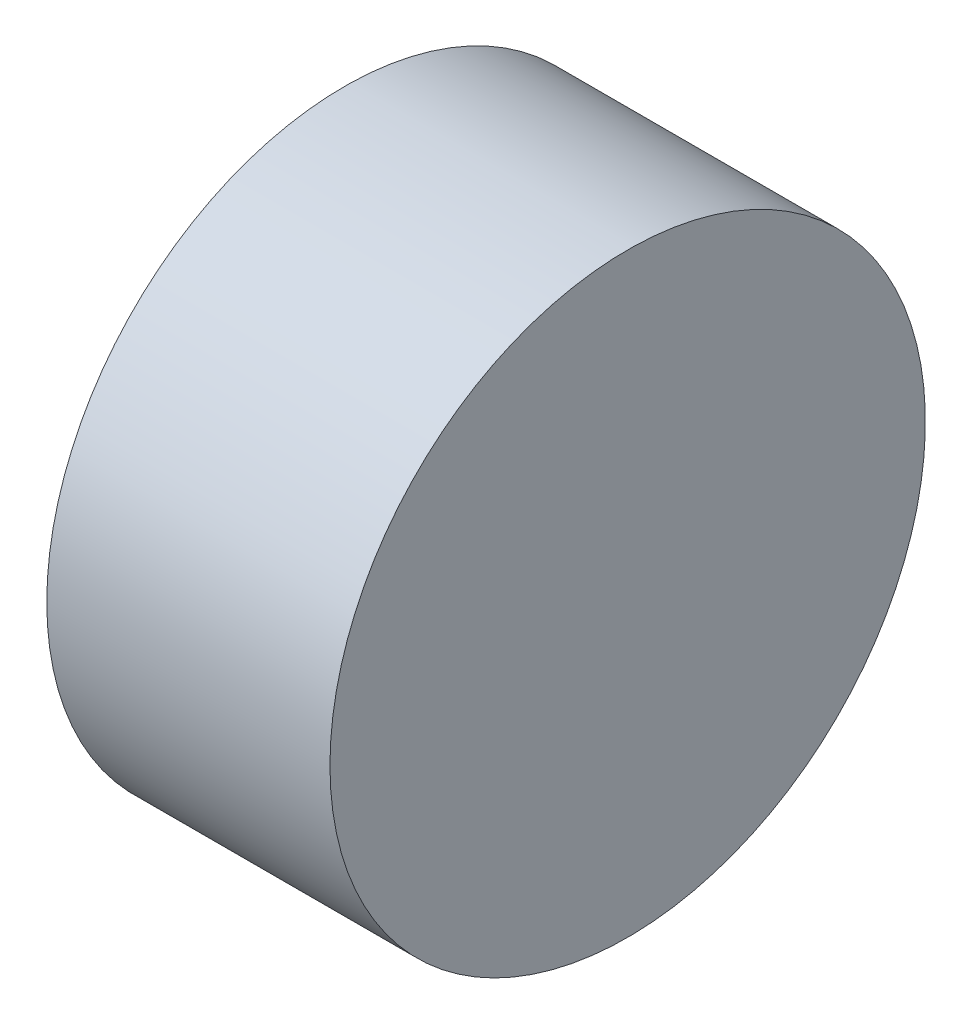
ISO-10303-21;
HEADER;
FILE_DESCRIPTION(('STEP AP214'),'2;1');
FILE_NAME('part.step','',(''),(''),'','','');
FILE_SCHEMA(('AUTOMOTIVE_DESIGN { 1 0 10303 214 1 1 1 1 }'));
ENDSEC;
DATA;
#1=APPLICATION_CONTEXT('core data for automotive mechanical design processes');
#2=APPLICATION_PROTOCOL_DEFINITION('international standard','automotive_design',2000,#1);
#3=PRODUCT_CONTEXT('',#1,'mechanical');
#4=PRODUCT('Part','Part','',(#3));
#5=PRODUCT_RELATED_PRODUCT_CATEGORY('part','',(#4));
#6=PRODUCT_DEFINITION_FORMATION('','',#4);
#7=PRODUCT_DEFINITION_CONTEXT('part definition',#1,'design');
#8=PRODUCT_DEFINITION('design','',#6,#7);
#9=PRODUCT_DEFINITION_SHAPE('','',#8);
#10=(LENGTH_UNIT() NAMED_UNIT(*) SI_UNIT(.MILLI.,.METRE.));
#11=(NAMED_UNIT(*) PLANE_ANGLE_UNIT() SI_UNIT($,.RADIAN.));
#12=(NAMED_UNIT(*) SI_UNIT($,.STERADIAN.) SOLID_ANGLE_UNIT());
#13=UNCERTAINTY_MEASURE_WITH_UNIT(LENGTH_MEASURE(1.E-05),#10,'distance_accuracy_value','');
#14=(GEOMETRIC_REPRESENTATION_CONTEXT(3) GLOBAL_UNCERTAINTY_ASSIGNED_CONTEXT((#13)) GLOBAL_UNIT_ASSIGNED_CONTEXT((#10,
#11,#12)) REPRESENTATION_CONTEXT('',''));
#15=CARTESIAN_POINT('',(0.,0.,0.));
#16=DIRECTION('',(0.,0.,1.));
#17=DIRECTION('',(1.,0.,0.));
#18=AXIS2_PLACEMENT_3D('',#15,#16,#17);
#19=CARTESIAN_POINT('',(-0.0752226746841484,0.652993760270337,-0.0422234324254024));
#20=DIRECTION('',(0.,-1.,0.));
#21=DIRECTION('',(0.,0.,1.));
#22=AXIS2_PLACEMENT_3D('',#19,#20,#21);
#23=CIRCLE('',#22,3.20279309525805);
#24=TRIMMED_CURVE('',#23,(PARAMETER_VALUE(-1.55761262921095)),
(PARAMETER_VALUE(1.55761262921095)),.T.,.PARAMETER.);
#25=CARTESIAN_POINT('',(-0.0752226746841484,0.652993760270337,0.));
#26=DIRECTION('',(-1.,0.,0.));
#27=AXIS1_PLACEMENT('',#25,#26);
#28=SURFACE_OF_REVOLUTION('',#24,#27);
#29=CARTESIAN_POINT('',(3.12729208606042,0.652993760270337,0.));
#30=VERTEX_POINT('',#29);
#31=VERTEX_LOOP('',#30);
#32=FACE_BOUND('',#31,.T.);
#33=CARTESIAN_POINT('',(-1.21548357368511,0.652993760270337,0.));
#34=DIRECTION('',(-1.,0.,0.));
#35=DIRECTION('',(0.,0.,1.));
#36=AXIS2_PLACEMENT_3D('',#33,#34,#35);
#37=CIRCLE('',#36,2.95071637539602);
#38=CARTESIAN_POINT('',(-1.21548357368511,0.652993760270337,2.95071637539602));
#39=VERTEX_POINT('',#38);
#40=EDGE_CURVE('E11',#39,#39,#37,.T.);
#41=ORIENTED_EDGE('',*,*,#40,.T.);
#42=EDGE_LOOP('',(#41));
#43=FACE_BOUND('',#42,.T.);
#44=ADVANCED_FACE('F33',(#32,#43),#28,.F.);
#45=CARTESIAN_POINT('',(-1.21548357368511,3.60371013566636,0.));
#46=DIRECTION('',(1.,0.,0.));
#47=DIRECTION('',(0.,0.,-1.));
#48=AXIS2_PLACEMENT_3D('',#45,#46,#47);
#49=PLANE('',#48);
#50=ORIENTED_EDGE('',*,*,#40,.F.);
#51=EDGE_LOOP('',(#50));
#52=FACE_BOUND('',#51,.T.);
#53=CARTESIAN_POINT('',(-1.21548357368511,0.652993760270337,0.));
#54=DIRECTION('',(-1.,0.,0.));
#55=DIRECTION('',(0.,0.,1.));
#56=AXIS2_PLACEMENT_3D('',#53,#54,#55);
#57=CIRCLE('',#56,6.03468761426515);
#58=CARTESIAN_POINT('',(-1.21548357368511,0.652993760270337,6.03468761426515));
#59=VERTEX_POINT('',#58);
#60=EDGE_CURVE('E39',#59,#59,#57,.T.);
#61=ORIENTED_EDGE('',*,*,#60,.T.);
#62=EDGE_LOOP('',(#61));
#63=FACE_BOUND('',#62,.T.);
#64=ADVANCED_FACE('F44',(#52,#63),#49,.F.);
#65=CARTESIAN_POINT('',(3.12729208606042,0.652993760270337,0.));
#66=DIRECTION('',(-1.,0.,0.));
#67=DIRECTION('',(0.,0.,1.));
#68=AXIS2_PLACEMENT_3D('',#65,#66,#67);
#69=CYLINDRICAL_SURFACE('',#68,6.03468761426515);
#70=ORIENTED_EDGE('',*,*,#60,.F.);
#71=EDGE_LOOP('',(#70));
#72=FACE_BOUND('',#71,.T.);
#73=CARTESIAN_POINT('',(4.52408109563146,0.652993760270337,0.));
#74=DIRECTION('',(-1.,0.,0.));
#75=DIRECTION('',(0.,0.,1.));
#76=AXIS2_PLACEMENT_3D('',#73,#74,#75);
#77=CIRCLE('',#76,6.03468761426515);
#78=CARTESIAN_POINT('',(4.52408109563146,0.652993760270337,6.03468761426515));
#79=VERTEX_POINT('',#78);
#80=EDGE_CURVE('E53',#79,#79,#77,.T.);
#81=ORIENTED_EDGE('',*,*,#80,.T.);
#82=EDGE_LOOP('',(#81));
#83=FACE_BOUND('',#82,.T.);
#84=ADVANCED_FACE('F49',(#72,#83),#69,.T.);
#85=CARTESIAN_POINT('',(4.52408109563146,6.68768137453548,0.));
#86=DIRECTION('',(-1.,0.,0.));
#87=DIRECTION('',(0.,0.,1.));
#88=AXIS2_PLACEMENT_3D('',#85,#86,#87);
#89=PLANE('',#88);
#90=ORIENTED_EDGE('',*,*,#80,.F.);
#91=EDGE_LOOP('',(#90));
#92=FACE_BOUND('',#91,.T.);
#93=ADVANCED_FACE('F59',(#92),#89,.F.);
#94=CLOSED_SHELL('',(#44,#64,#84,#93));
#95=MANIFOLD_SOLID_BREP('B2',#94);
#96=ADVANCED_BREP_SHAPE_REPRESENTATION('',(#18,#95),#14);
#97=SHAPE_DEFINITION_REPRESENTATION(#9,#96);
ENDSEC;
END-ISO-10303-21;
